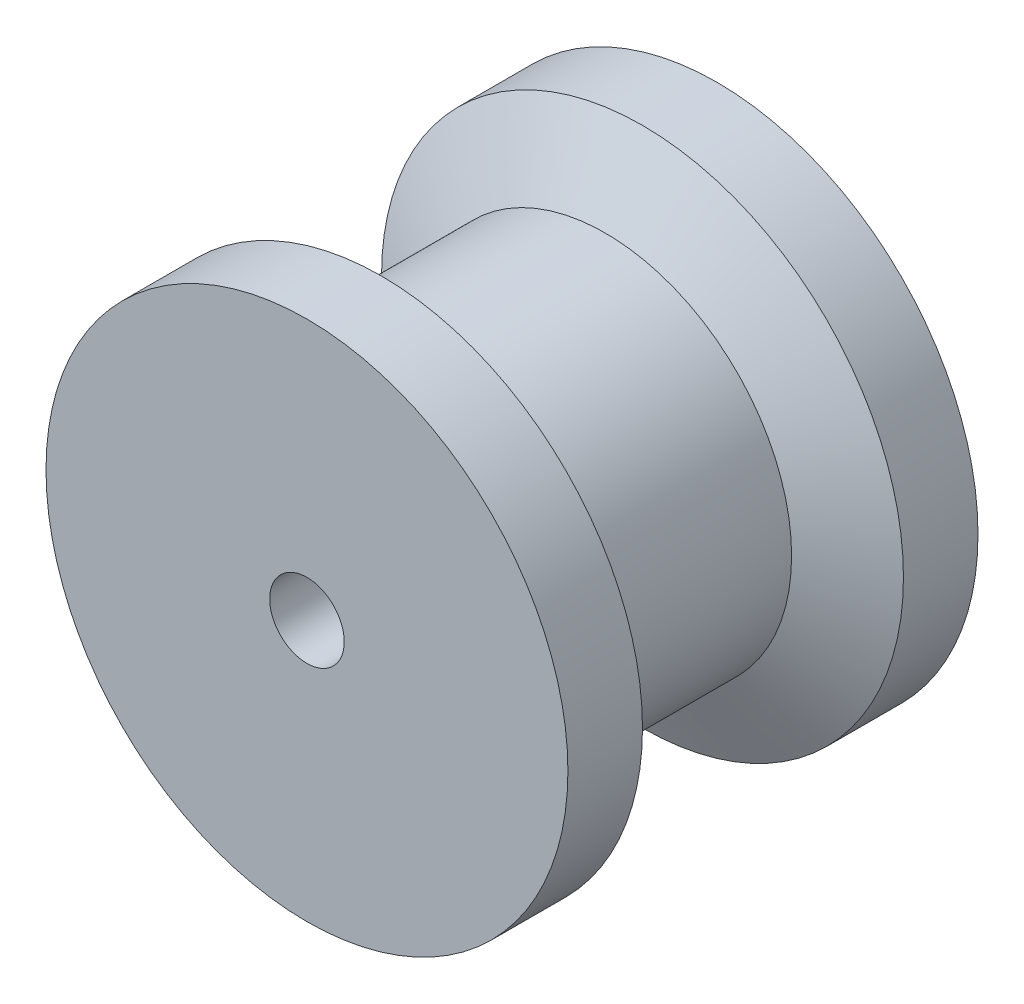
ISO-10303-21;
HEADER;
FILE_DESCRIPTION(('STEP AP214'),'2;1');
FILE_NAME('part.step','',(''),(''),'','','');
FILE_SCHEMA(('AUTOMOTIVE_DESIGN { 1 0 10303 214 1 1 1 1 }'));
ENDSEC;
DATA;
#1=APPLICATION_CONTEXT('core data for automotive mechanical design processes');
#2=APPLICATION_PROTOCOL_DEFINITION('international standard','automotive_design',2000,#1);
#3=PRODUCT_CONTEXT('',#1,'mechanical');
#4=PRODUCT('Part','Part','',(#3));
#5=PRODUCT_RELATED_PRODUCT_CATEGORY('part','',(#4));
#6=PRODUCT_DEFINITION_FORMATION('','',#4);
#7=PRODUCT_DEFINITION_CONTEXT('part definition',#1,'design');
#8=PRODUCT_DEFINITION('design','',#6,#7);
#9=PRODUCT_DEFINITION_SHAPE('','',#8);
#10=(LENGTH_UNIT() NAMED_UNIT(*) SI_UNIT(.MILLI.,.METRE.));
#11=(NAMED_UNIT(*) PLANE_ANGLE_UNIT() SI_UNIT($,.RADIAN.));
#12=(NAMED_UNIT(*) SI_UNIT($,.STERADIAN.) SOLID_ANGLE_UNIT());
#13=UNCERTAINTY_MEASURE_WITH_UNIT(LENGTH_MEASURE(1.E-05),#10,'distance_accuracy_value','');
#14=(GEOMETRIC_REPRESENTATION_CONTEXT(3) GLOBAL_UNCERTAINTY_ASSIGNED_CONTEXT((#13)) GLOBAL_UNIT_ASSIGNED_CONTEXT((#10,
#11,#12)) REPRESENTATION_CONTEXT('',''));
#15=CARTESIAN_POINT('',(0.,0.,0.));
#16=DIRECTION('',(0.,0.,1.));
#17=DIRECTION('',(1.,0.,0.));
#18=AXIS2_PLACEMENT_3D('',#15,#16,#17);
#19=CARTESIAN_POINT('',(0.,0.,11.));
#20=DIRECTION('',(0.,0.,-1.));
#21=DIRECTION('',(-1.,0.,0.));
#22=AXIS2_PLACEMENT_3D('',#19,#20,#21);
#23=CYLINDRICAL_SURFACE('',#22,7.);
#24=CARTESIAN_POINT('',(0.,0.,0.));
#25=DIRECTION('',(0.,0.,1.));
#26=DIRECTION('',(1.,0.,0.));
#27=AXIS2_PLACEMENT_3D('',#24,#25,#26);
#28=CIRCLE('',#27,7.);
#29=CARTESIAN_POINT('',(7.,0.,0.));
#30=VERTEX_POINT('',#29);
#31=EDGE_CURVE('E44',#30,#30,#28,.T.);
#32=ORIENTED_EDGE('',*,*,#31,.T.);
#33=EDGE_LOOP('',(#32));
#34=FACE_BOUND('',#33,.T.);
#35=CARTESIAN_POINT('',(0.,0.,2.));
#36=DIRECTION('',(0.,0.,1.));
#37=DIRECTION('',(1.,0.,0.));
#38=AXIS2_PLACEMENT_3D('',#35,#36,#37);
#39=CIRCLE('',#38,7.);
#40=CARTESIAN_POINT('',(7.,0.,2.));
#41=VERTEX_POINT('',#40);
#42=EDGE_CURVE('E59',#41,#41,#39,.T.);
#43=ORIENTED_EDGE('',*,*,#42,.F.);
#44=EDGE_LOOP('',(#43));
#45=FACE_BOUND('',#44,.T.);
#46=ADVANCED_FACE('F41',(#34,#45),#23,.T.);
#47=CARTESIAN_POINT('',(0.,0.,11.));
#48=DIRECTION('',(0.,0.,1.));
#49=DIRECTION('',(1.,0.,0.));
#50=AXIS2_PLACEMENT_3D('',#47,#48,#49);
#51=CIRCLE('',#50,7.);
#52=CARTESIAN_POINT('',(7.,0.,11.));
#53=VERTEX_POINT('',#52);
#54=EDGE_CURVE('E10',#53,#53,#51,.T.);
#55=ORIENTED_EDGE('',*,*,#54,.F.);
#56=EDGE_LOOP('',(#55));
#57=FACE_BOUND('',#56,.T.);
#58=CARTESIAN_POINT('',(0.,0.,9.00000000000001));
#59=DIRECTION('',(0.,0.,1.));
#60=DIRECTION('',(1.,0.,0.));
#61=AXIS2_PLACEMENT_3D('',#58,#59,#60);
#62=CIRCLE('',#61,7.);
#63=CARTESIAN_POINT('',(7.,0.,9.00000000000001));
#64=VERTEX_POINT('',#63);
#65=EDGE_CURVE('E74',#64,#64,#62,.T.);
#66=ORIENTED_EDGE('',*,*,#65,.T.);
#67=EDGE_LOOP('',(#66));
#68=FACE_BOUND('',#67,.T.);
#69=ADVANCED_FACE('F79',(#57,#68),#23,.T.);
#70=CARTESIAN_POINT('',(0.,0.,11.));
#71=DIRECTION('',(0.,0.,1.));
#72=DIRECTION('',(1.,0.,0.));
#73=AXIS2_PLACEMENT_3D('',#70,#71,#72);
#74=PLANE('',#73);
#75=ORIENTED_EDGE('',*,*,#54,.T.);
#76=EDGE_LOOP('',(#75));
#77=FACE_BOUND('',#76,.T.);
#78=CARTESIAN_POINT('',(0.,0.,11.));
#79=DIRECTION('',(0.,0.,1.));
#80=DIRECTION('',(1.,0.,0.));
#81=AXIS2_PLACEMENT_3D('',#78,#79,#80);
#82=CIRCLE('',#81,1.);
#83=CARTESIAN_POINT('',(1.,0.,11.));
#84=VERTEX_POINT('',#83);
#85=EDGE_CURVE('E53',#84,#84,#82,.T.);
#86=ORIENTED_EDGE('',*,*,#85,.F.);
#87=EDGE_LOOP('',(#86));
#88=FACE_BOUND('',#87,.T.);
#89=ADVANCED_FACE('F97',(#77,#88),#74,.T.);
#90=CARTESIAN_POINT('',(0.,0.,0.));
#91=DIRECTION('',(0.,0.,1.));
#92=DIRECTION('',(1.,0.,0.));
#93=AXIS2_PLACEMENT_3D('',#90,#91,#92);
#94=PLANE('',#93);
#95=ORIENTED_EDGE('',*,*,#31,.F.);
#96=EDGE_LOOP('',(#95));
#97=FACE_BOUND('',#96,.T.);
#98=CARTESIAN_POINT('',(0.,0.,0.));
#99=DIRECTION('',(0.,0.,1.));
#100=DIRECTION('',(1.,0.,0.));
#101=AXIS2_PLACEMENT_3D('',#98,#99,#100);
#102=CIRCLE('',#101,1.);
#103=CARTESIAN_POINT('',(1.,0.,0.));
#104=VERTEX_POINT('',#103);
#105=EDGE_CURVE('E55',#104,#104,#102,.T.);
#106=ORIENTED_EDGE('',*,*,#105,.T.);
#107=EDGE_LOOP('',(#106));
#108=FACE_BOUND('',#107,.T.);
#109=ADVANCED_FACE('F113',(#97,#108),#94,.F.);
#110=CARTESIAN_POINT('',(0.,0.,11.));
#111=DIRECTION('',(0.,0.,-1.));
#112=DIRECTION('',(-1.,0.,0.));
#113=AXIS2_PLACEMENT_3D('',#110,#111,#112);
#114=CYLINDRICAL_SURFACE('',#113,1.);
#115=ORIENTED_EDGE('',*,*,#85,.T.);
#116=EDGE_LOOP('',(#115));
#117=FACE_BOUND('',#116,.T.);
#118=ORIENTED_EDGE('',*,*,#105,.F.);
#119=EDGE_LOOP('',(#118));
#120=FACE_BOUND('',#119,.T.);
#121=ADVANCED_FACE('F105',(#117,#120),#114,.F.);
#122=CARTESIAN_POINT('',(0.,0.,3.));
#123=DIRECTION('',(0.,0.,-1.));
#124=DIRECTION('',(-1.,0.,0.));
#125=AXIS2_PLACEMENT_3D('',#122,#123,#124);
#126=CONICAL_SURFACE('',#125,5.,1.10714871779409);
#127=ORIENTED_EDGE('',*,*,#42,.T.);
#128=EDGE_LOOP('',(#127));
#129=FACE_BOUND('',#128,.T.);
#130=CARTESIAN_POINT('',(0.,0.,3.));
#131=DIRECTION('',(0.,0.,1.));
#132=DIRECTION('',(1.,0.,0.));
#133=AXIS2_PLACEMENT_3D('',#130,#131,#132);
#134=CIRCLE('',#133,5.);
#135=CARTESIAN_POINT('',(5.,0.,3.));
#136=VERTEX_POINT('',#135);
#137=EDGE_CURVE('E66',#136,#136,#134,.T.);
#138=ORIENTED_EDGE('',*,*,#137,.F.);
#139=EDGE_LOOP('',(#138));
#140=FACE_BOUND('',#139,.T.);
#141=ADVANCED_FACE('F89',(#129,#140),#126,.T.);
#142=CARTESIAN_POINT('',(0.,0.,1000.));
#143=DIRECTION('',(0.,0.,1.));
#144=DIRECTION('',(1.,0.,0.));
#145=AXIS2_PLACEMENT_3D('',#142,#143,#144);
#146=CYLINDRICAL_SURFACE('',#145,5.);
#147=ORIENTED_EDGE('',*,*,#137,.T.);
#148=EDGE_LOOP('',(#147));
#149=FACE_BOUND('',#148,.T.);
#150=CARTESIAN_POINT('',(0.,0.,8.00000000000001));
#151=DIRECTION('',(0.,0.,1.));
#152=DIRECTION('',(1.,0.,0.));
#153=AXIS2_PLACEMENT_3D('',#150,#151,#152);
#154=CIRCLE('',#153,5.);
#155=CARTESIAN_POINT('',(5.,0.,8.00000000000001));
#156=VERTEX_POINT('',#155);
#157=EDGE_CURVE('E70',#156,#156,#154,.T.);
#158=ORIENTED_EDGE('',*,*,#157,.F.);
#159=EDGE_LOOP('',(#158));
#160=FACE_BOUND('',#159,.T.);
#161=ADVANCED_FACE('F83',(#149,#160),#146,.T.);
#162=CARTESIAN_POINT('',(0.,0.,9.00000000000001));
#163=DIRECTION('',(0.,0.,1.));
#164=DIRECTION('',(1.,0.,0.));
#165=AXIS2_PLACEMENT_3D('',#162,#163,#164);
#166=CONICAL_SURFACE('',#165,7.,1.10714871779409);
#167=ORIENTED_EDGE('',*,*,#157,.T.);
#168=EDGE_LOOP('',(#167));
#169=FACE_BOUND('',#168,.T.);
#170=ORIENTED_EDGE('',*,*,#65,.F.);
#171=EDGE_LOOP('',(#170));
#172=FACE_BOUND('',#171,.T.);
#173=ADVANCED_FACE('F81',(#169,#172),#166,.T.);
#174=CLOSED_SHELL('',(#46,#69,#89,#109,#121,#141,#161,#173));
#175=MANIFOLD_SOLID_BREP('B2',#174);
#176=ADVANCED_BREP_SHAPE_REPRESENTATION('',(#18,#175),#14);
#177=SHAPE_DEFINITION_REPRESENTATION(#9,#176);
ENDSEC;
END-ISO-10303-21;
